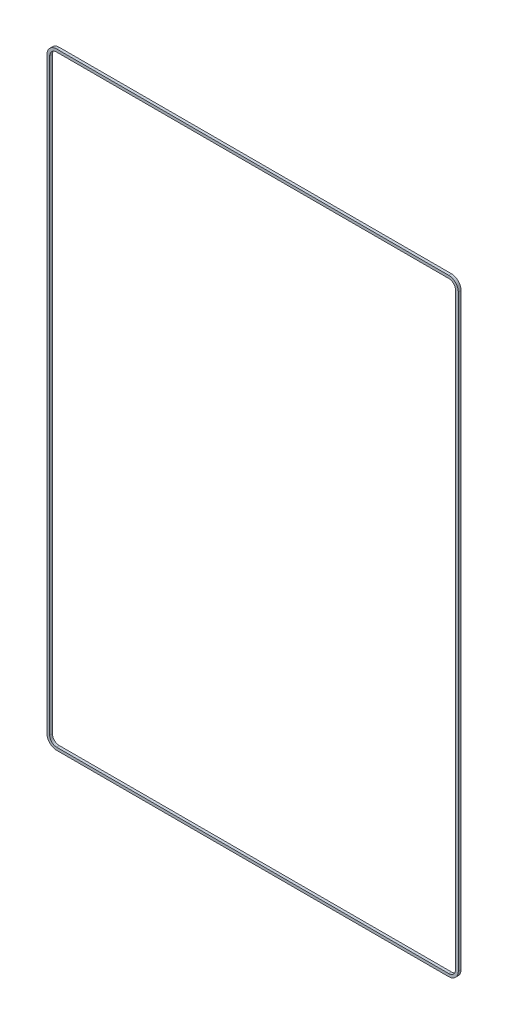
ISO-10303-21;
HEADER;
FILE_DESCRIPTION(('STEP AP214'),'2;1');
FILE_NAME('part.step','',(''),(''),'','','');
FILE_SCHEMA(('AUTOMOTIVE_DESIGN { 1 0 10303 214 1 1 1 1 }'));
ENDSEC;
DATA;
#1=APPLICATION_CONTEXT('core data for automotive mechanical design processes');
#2=APPLICATION_PROTOCOL_DEFINITION('international standard','automotive_design',2000,#1);
#3=PRODUCT_CONTEXT('',#1,'mechanical');
#4=PRODUCT('Part','Part','',(#3));
#5=PRODUCT_RELATED_PRODUCT_CATEGORY('part','',(#4));
#6=PRODUCT_DEFINITION_FORMATION('','',#4);
#7=PRODUCT_DEFINITION_CONTEXT('part definition',#1,'design');
#8=PRODUCT_DEFINITION('design','',#6,#7);
#9=PRODUCT_DEFINITION_SHAPE('','',#8);
#10=(LENGTH_UNIT() NAMED_UNIT(*) SI_UNIT(.MILLI.,.METRE.));
#11=(NAMED_UNIT(*) PLANE_ANGLE_UNIT() SI_UNIT($,.RADIAN.));
#12=(NAMED_UNIT(*) SI_UNIT($,.STERADIAN.) SOLID_ANGLE_UNIT());
#13=UNCERTAINTY_MEASURE_WITH_UNIT(LENGTH_MEASURE(1.E-05),#10,'distance_accuracy_value','');
#14=(GEOMETRIC_REPRESENTATION_CONTEXT(3) GLOBAL_UNCERTAINTY_ASSIGNED_CONTEXT((#13)) GLOBAL_UNIT_ASSIGNED_CONTEXT((#10,
#11,#12)) REPRESENTATION_CONTEXT('',''));
#15=CARTESIAN_POINT('',(0.,0.,0.));
#16=DIRECTION('',(0.,0.,1.));
#17=DIRECTION('',(1.,0.,0.));
#18=AXIS2_PLACEMENT_3D('',#15,#16,#17);
#19=CARTESIAN_POINT('',(0.,-0.127,1.778));
#20=DIRECTION('',(0.,1.,0.));
#21=DIRECTION('',(-1.,0.,0.));
#22=AXIS2_PLACEMENT_3D('',#19,#20,#21);
#23=PLANE('',#22);
#24=DIRECTION('',(1.,0.,0.));
#25=VECTOR('',#24,1.);
#26=CARTESIAN_POINT('',(0.,-0.127,0.));
#27=LINE('',#26,#25);
#28=CARTESIAN_POINT('',(4.31800000000003,-0.127,0.));
#29=VERTEX_POINT('',#28);
#30=CARTESIAN_POINT('',(258.318,-0.126999999999994,0.));
#31=VERTEX_POINT('',#30);
#32=EDGE_CURVE('E205',#29,#31,#27,.T.);
#33=ORIENTED_EDGE('',*,*,#32,.F.);
#34=DIRECTION('',(0.,0.,-1.));
#35=VECTOR('',#34,1.);
#36=CARTESIAN_POINT('',(4.31800000000003,-0.127,1.778));
#37=LINE('',#36,#35);
#38=CARTESIAN_POINT('',(4.31800000000003,-0.127,1.778));
#39=VERTEX_POINT('',#38);
#40=EDGE_CURVE('E11',#39,#29,#37,.T.);
#41=ORIENTED_EDGE('',*,*,#40,.F.);
#42=DIRECTION('',(1.,0.,0.));
#43=VECTOR('',#42,1.);
#44=CARTESIAN_POINT('',(0.,-0.127,1.778));
#45=LINE('',#44,#43);
#46=CARTESIAN_POINT('',(258.318,-0.126999999999994,1.778));
#47=VERTEX_POINT('',#46);
#48=EDGE_CURVE('E305',#39,#47,#45,.T.);
#49=ORIENTED_EDGE('',*,*,#48,.T.);
#50=DIRECTION('',(0.,0.,-1.));
#51=VECTOR('',#50,1.);
#52=CARTESIAN_POINT('',(258.318,-0.126999999999994,1.778));
#53=LINE('',#52,#51);
#54=EDGE_CURVE('E54',#47,#31,#53,.T.);
#55=ORIENTED_EDGE('',*,*,#54,.T.);
#56=EDGE_LOOP('',(#33,#41,#49,#55));
#57=FACE_BOUND('',#56,.T.);
#58=ADVANCED_FACE('F35',(#57),#23,.T.);
#59=CARTESIAN_POINT('',(4.318,4.318,1.778));
#60=DIRECTION('',(0.,0.,-1.));
#61=DIRECTION('',(-1.,0.,0.));
#62=AXIS2_PLACEMENT_3D('',#59,#60,#61);
#63=CYLINDRICAL_SURFACE('',#62,4.445);
#64=CARTESIAN_POINT('',(4.318,4.318,0.));
#65=DIRECTION('',(0.,0.,1.));
#66=DIRECTION('',(1.,0.,0.));
#67=AXIS2_PLACEMENT_3D('',#64,#65,#66);
#68=CIRCLE('',#67,4.445);
#69=CARTESIAN_POINT('',(-0.127,4.31800000000003,0.));
#70=VERTEX_POINT('',#69);
#71=EDGE_CURVE('E207',#29,#70,#68,.F.);
#72=ORIENTED_EDGE('',*,*,#71,.T.);
#73=DIRECTION('',(0.,0.,-1.));
#74=VECTOR('',#73,1.);
#75=CARTESIAN_POINT('',(-0.127,4.31800000000003,1.778));
#76=LINE('',#75,#74);
#77=CARTESIAN_POINT('',(-0.127,4.31800000000003,1.778));
#78=VERTEX_POINT('',#77);
#79=EDGE_CURVE('E45',#78,#70,#76,.T.);
#80=ORIENTED_EDGE('',*,*,#79,.F.);
#81=CARTESIAN_POINT('',(4.318,4.318,1.778));
#82=DIRECTION('',(0.,0.,1.));
#83=DIRECTION('',(1.,0.,0.));
#84=AXIS2_PLACEMENT_3D('',#81,#82,#83);
#85=CIRCLE('',#84,4.445);
#86=EDGE_CURVE('E307',#39,#78,#85,.F.);
#87=ORIENTED_EDGE('',*,*,#86,.F.);
#88=ORIENTED_EDGE('',*,*,#40,.T.);
#89=EDGE_LOOP('',(#72,#80,#87,#88));
#90=FACE_BOUND('',#89,.T.);
#91=ADVANCED_FACE('F333',(#90),#63,.F.);
#92=CARTESIAN_POINT('',(-0.127,0.,1.778));
#93=DIRECTION('',(-1.,0.,0.));
#94=DIRECTION('',(0.,0.,1.));
#95=AXIS2_PLACEMENT_3D('',#92,#93,#94);
#96=PLANE('',#95);
#97=DIRECTION('',(0.,1.,0.));
#98=VECTOR('',#97,1.);
#99=CARTESIAN_POINT('',(-0.127,0.,0.));
#100=LINE('',#99,#98);
#101=CARTESIAN_POINT('',(-0.127,385.318,0.));
#102=VERTEX_POINT('',#101);
#103=EDGE_CURVE('E210',#70,#102,#100,.T.);
#104=ORIENTED_EDGE('',*,*,#103,.T.);
#105=DIRECTION('',(0.,0.,-1.));
#106=VECTOR('',#105,1.);
#107=CARTESIAN_POINT('',(-0.127,385.318,1.778));
#108=LINE('',#107,#106);
#109=CARTESIAN_POINT('',(-0.127,385.318,1.778));
#110=VERTEX_POINT('',#109);
#111=EDGE_CURVE('E232',#110,#102,#108,.T.);
#112=ORIENTED_EDGE('',*,*,#111,.F.);
#113=DIRECTION('',(0.,1.,0.));
#114=VECTOR('',#113,1.);
#115=CARTESIAN_POINT('',(-0.127,0.,1.778));
#116=LINE('',#115,#114);
#117=EDGE_CURVE('E310',#78,#110,#116,.T.);
#118=ORIENTED_EDGE('',*,*,#117,.F.);
#119=ORIENTED_EDGE('',*,*,#79,.T.);
#120=EDGE_LOOP('',(#104,#112,#118,#119));
#121=FACE_BOUND('',#120,.T.);
#122=ADVANCED_FACE('F338',(#121),#96,.F.);
#123=CARTESIAN_POINT('',(4.318,385.318,1.778));
#124=DIRECTION('',(0.,0.,-1.));
#125=DIRECTION('',(-1.,0.,0.));
#126=AXIS2_PLACEMENT_3D('',#123,#124,#125);
#127=CYLINDRICAL_SURFACE('',#126,4.44499999999999);
#128=CARTESIAN_POINT('',(4.318,385.318,0.));
#129=DIRECTION('',(0.,0.,1.));
#130=DIRECTION('',(1.,0.,0.));
#131=AXIS2_PLACEMENT_3D('',#128,#129,#130);
#132=CIRCLE('',#131,4.44499999999999);
#133=CARTESIAN_POINT('',(4.318,389.763,0.));
#134=VERTEX_POINT('',#133);
#135=EDGE_CURVE('E213',#102,#134,#132,.F.);
#136=ORIENTED_EDGE('',*,*,#135,.T.);
#137=DIRECTION('',(0.,0.,-1.));
#138=VECTOR('',#137,1.);
#139=CARTESIAN_POINT('',(4.318,389.763,1.778));
#140=LINE('',#139,#138);
#141=CARTESIAN_POINT('',(4.318,389.763,1.778));
#142=VERTEX_POINT('',#141);
#143=EDGE_CURVE('E229',#142,#134,#140,.T.);
#144=ORIENTED_EDGE('',*,*,#143,.F.);
#145=CARTESIAN_POINT('',(4.318,385.318,1.778));
#146=DIRECTION('',(0.,0.,1.));
#147=DIRECTION('',(1.,0.,0.));
#148=AXIS2_PLACEMENT_3D('',#145,#146,#147);
#149=CIRCLE('',#148,4.44499999999999);
#150=EDGE_CURVE('E313',#110,#142,#149,.F.);
#151=ORIENTED_EDGE('',*,*,#150,.F.);
#152=ORIENTED_EDGE('',*,*,#111,.T.);
#153=EDGE_LOOP('',(#136,#144,#151,#152));
#154=FACE_BOUND('',#153,.T.);
#155=ADVANCED_FACE('F317',(#154),#127,.F.);
#156=CARTESIAN_POINT('',(0.,389.763,1.778));
#157=DIRECTION('',(0.,1.,0.));
#158=DIRECTION('',(0.,0.,1.));
#159=AXIS2_PLACEMENT_3D('',#156,#157,#158);
#160=PLANE('',#159);
#161=DIRECTION('',(1.,0.,0.));
#162=VECTOR('',#161,1.);
#163=CARTESIAN_POINT('',(0.,389.763,0.));
#164=LINE('',#163,#162);
#165=CARTESIAN_POINT('',(258.318,389.763,0.));
#166=VERTEX_POINT('',#165);
#167=EDGE_CURVE('E216',#134,#166,#164,.T.);
#168=ORIENTED_EDGE('',*,*,#167,.T.);
#169=DIRECTION('',(0.,0.,-1.));
#170=VECTOR('',#169,1.);
#171=CARTESIAN_POINT('',(258.318,389.763,1.778));
#172=LINE('',#171,#170);
#173=CARTESIAN_POINT('',(258.318,389.763,1.778));
#174=VERTEX_POINT('',#173);
#175=EDGE_CURVE('E174',#174,#166,#172,.T.);
#176=ORIENTED_EDGE('',*,*,#175,.F.);
#177=DIRECTION('',(1.,0.,0.));
#178=VECTOR('',#177,1.);
#179=CARTESIAN_POINT('',(0.,389.763,1.778));
#180=LINE('',#179,#178);
#181=EDGE_CURVE('E163',#142,#174,#180,.T.);
#182=ORIENTED_EDGE('',*,*,#181,.F.);
#183=ORIENTED_EDGE('',*,*,#143,.T.);
#184=EDGE_LOOP('',(#168,#176,#182,#183));
#185=FACE_BOUND('',#184,.T.);
#186=ADVANCED_FACE('F319',(#185),#160,.F.);
#187=CARTESIAN_POINT('',(258.318,385.318,1.778));
#188=DIRECTION('',(0.,0.,-1.));
#189=DIRECTION('',(-1.,0.,0.));
#190=AXIS2_PLACEMENT_3D('',#187,#188,#189);
#191=CYLINDRICAL_SURFACE('',#190,4.44499999999998);
#192=CARTESIAN_POINT('',(258.318,385.318,0.));
#193=DIRECTION('',(0.,0.,1.));
#194=DIRECTION('',(1.,0.,0.));
#195=AXIS2_PLACEMENT_3D('',#192,#193,#194);
#196=CIRCLE('',#195,4.44499999999998);
#197=CARTESIAN_POINT('',(262.763,385.318,0.));
#198=VERTEX_POINT('',#197);
#199=EDGE_CURVE('E171',#166,#198,#196,.F.);
#200=ORIENTED_EDGE('',*,*,#199,.T.);
#201=DIRECTION('',(0.,0.,-1.));
#202=VECTOR('',#201,1.);
#203=CARTESIAN_POINT('',(262.763,385.318,1.778));
#204=LINE('',#203,#202);
#205=CARTESIAN_POINT('',(262.763,385.318,1.778));
#206=VERTEX_POINT('',#205);
#207=EDGE_CURVE('E169',#206,#198,#204,.T.);
#208=ORIENTED_EDGE('',*,*,#207,.F.);
#209=CARTESIAN_POINT('',(258.318,385.318,1.778));
#210=DIRECTION('',(0.,0.,1.));
#211=DIRECTION('',(1.,0.,0.));
#212=AXIS2_PLACEMENT_3D('',#209,#210,#211);
#213=CIRCLE('',#212,4.44499999999998);
#214=EDGE_CURVE('E155',#174,#206,#213,.F.);
#215=ORIENTED_EDGE('',*,*,#214,.F.);
#216=ORIENTED_EDGE('',*,*,#175,.T.);
#217=EDGE_LOOP('',(#200,#208,#215,#216));
#218=FACE_BOUND('',#217,.T.);
#219=ADVANCED_FACE('F170',(#218),#191,.F.);
#220=CARTESIAN_POINT('',(262.763,0.,1.778));
#221=DIRECTION('',(-1.,0.,0.));
#222=DIRECTION('',(0.,-1.,0.));
#223=AXIS2_PLACEMENT_3D('',#220,#221,#222);
#224=PLANE('',#223);
#225=DIRECTION('',(0.,1.,0.));
#226=VECTOR('',#225,1.);
#227=CARTESIAN_POINT('',(262.763,0.,0.));
#228=LINE('',#227,#226);
#229=CARTESIAN_POINT('',(262.763,4.31800000000003,0.));
#230=VERTEX_POINT('',#229);
#231=EDGE_CURVE('E220',#230,#198,#228,.T.);
#232=ORIENTED_EDGE('',*,*,#231,.F.);
#233=DIRECTION('',(0.,0.,-1.));
#234=VECTOR('',#233,1.);
#235=CARTESIAN_POINT('',(262.763,4.31800000000003,1.778));
#236=LINE('',#235,#234);
#237=CARTESIAN_POINT('',(262.763,4.31800000000003,1.778));
#238=VERTEX_POINT('',#237);
#239=EDGE_CURVE('E103',#238,#230,#236,.T.);
#240=ORIENTED_EDGE('',*,*,#239,.F.);
#241=DIRECTION('',(0.,1.,0.));
#242=VECTOR('',#241,1.);
#243=CARTESIAN_POINT('',(262.763,0.,1.778));
#244=LINE('',#243,#242);
#245=EDGE_CURVE('E161',#238,#206,#244,.T.);
#246=ORIENTED_EDGE('',*,*,#245,.T.);
#247=ORIENTED_EDGE('',*,*,#207,.T.);
#248=EDGE_LOOP('',(#232,#240,#246,#247));
#249=FACE_BOUND('',#248,.T.);
#250=ADVANCED_FACE('F176',(#249),#224,.T.);
#251=CARTESIAN_POINT('',(4.318,4.318,1.778));
#252=DIRECTION('',(0.,0.,-1.));
#253=DIRECTION('',(-1.,0.,0.));
#254=AXIS2_PLACEMENT_3D('',#251,#252,#253);
#255=CYLINDRICAL_SURFACE('',#254,6.223);
#256=CARTESIAN_POINT('',(4.318,4.318,0.));
#257=DIRECTION('',(0.,0.,1.));
#258=DIRECTION('',(1.,0.,0.));
#259=AXIS2_PLACEMENT_3D('',#256,#257,#258);
#260=CIRCLE('',#259,6.223);
#261=CARTESIAN_POINT('',(4.31800000000003,-1.905,0.));
#262=VERTEX_POINT('',#261);
#263=CARTESIAN_POINT('',(-1.905,4.31800000000003,0.));
#264=VERTEX_POINT('',#263);
#265=EDGE_CURVE('E183',#262,#264,#260,.F.);
#266=ORIENTED_EDGE('',*,*,#265,.F.);
#267=DIRECTION('',(0.,0.,-1.));
#268=VECTOR('',#267,1.);
#269=CARTESIAN_POINT('',(4.31800000000003,-1.905,1.778));
#270=LINE('',#269,#268);
#271=CARTESIAN_POINT('',(4.31800000000003,-1.905,1.778));
#272=VERTEX_POINT('',#271);
#273=EDGE_CURVE('E39',#272,#262,#270,.T.);
#274=ORIENTED_EDGE('',*,*,#273,.F.);
#275=CARTESIAN_POINT('',(4.318,4.318,1.778));
#276=DIRECTION('',(0.,0.,1.));
#277=DIRECTION('',(1.,0.,0.));
#278=AXIS2_PLACEMENT_3D('',#275,#276,#277);
#279=CIRCLE('',#278,6.223);
#280=CARTESIAN_POINT('',(-1.905,4.31800000000003,1.778));
#281=VERTEX_POINT('',#280);
#282=EDGE_CURVE('E225',#272,#281,#279,.F.);
#283=ORIENTED_EDGE('',*,*,#282,.T.);
#284=DIRECTION('',(0.,0.,-1.));
#285=VECTOR('',#284,1.);
#286=CARTESIAN_POINT('',(-1.905,4.31800000000003,1.778));
#287=LINE('',#286,#285);
#288=EDGE_CURVE('E179',#281,#264,#287,.T.);
#289=ORIENTED_EDGE('',*,*,#288,.T.);
#290=EDGE_LOOP('',(#266,#274,#283,#289));
#291=FACE_BOUND('',#290,.T.);
#292=ADVANCED_FACE('F37',(#291),#255,.T.);
#293=CARTESIAN_POINT('',(0.,-1.905,1.778));
#294=DIRECTION('',(0.,1.,0.));
#295=DIRECTION('',(-1.,0.,0.));
#296=AXIS2_PLACEMENT_3D('',#293,#294,#295);
#297=PLANE('',#296);
#298=DIRECTION('',(1.,0.,0.));
#299=VECTOR('',#298,1.);
#300=CARTESIAN_POINT('',(0.,-1.905,0.));
#301=LINE('',#300,#299);
#302=CARTESIAN_POINT('',(258.318,-1.905,0.));
#303=VERTEX_POINT('',#302);
#304=EDGE_CURVE('E186',#262,#303,#301,.T.);
#305=ORIENTED_EDGE('',*,*,#304,.T.);
#306=DIRECTION('',(0.,0.,-1.));
#307=VECTOR('',#306,1.);
#308=CARTESIAN_POINT('',(258.318,-1.905,1.778));
#309=LINE('',#308,#307);
#310=CARTESIAN_POINT('',(258.318,-1.905,1.778));
#311=VERTEX_POINT('',#310);
#312=EDGE_CURVE('E248',#311,#303,#309,.T.);
#313=ORIENTED_EDGE('',*,*,#312,.F.);
#314=DIRECTION('',(1.,0.,0.));
#315=VECTOR('',#314,1.);
#316=CARTESIAN_POINT('',(0.,-1.905,1.778));
#317=LINE('',#316,#315);
#318=EDGE_CURVE('E257',#272,#311,#317,.T.);
#319=ORIENTED_EDGE('',*,*,#318,.F.);
#320=ORIENTED_EDGE('',*,*,#273,.T.);
#321=EDGE_LOOP('',(#305,#313,#319,#320));
#322=FACE_BOUND('',#321,.T.);
#323=ADVANCED_FACE('F256',(#322),#297,.F.);
#324=CARTESIAN_POINT('',(258.318,4.318,1.778));
#325=DIRECTION('',(0.,0.,-1.));
#326=DIRECTION('',(-1.,0.,0.));
#327=AXIS2_PLACEMENT_3D('',#324,#325,#326);
#328=CYLINDRICAL_SURFACE('',#327,6.22299999999999);
#329=CARTESIAN_POINT('',(258.318,4.318,0.));
#330=DIRECTION('',(0.,0.,1.));
#331=DIRECTION('',(1.,0.,0.));
#332=AXIS2_PLACEMENT_3D('',#329,#330,#331);
#333=CIRCLE('',#332,6.22299999999999);
#334=CARTESIAN_POINT('',(264.541,4.318,0.));
#335=VERTEX_POINT('',#334);
#336=EDGE_CURVE('E188',#303,#335,#333,.T.);
#337=ORIENTED_EDGE('',*,*,#336,.T.);
#338=DIRECTION('',(0.,0.,-1.));
#339=VECTOR('',#338,1.);
#340=CARTESIAN_POINT('',(264.541,4.318,1.778));
#341=LINE('',#340,#339);
#342=CARTESIAN_POINT('',(264.541,4.318,1.778));
#343=VERTEX_POINT('',#342);
#344=EDGE_CURVE('E246',#343,#335,#341,.T.);
#345=ORIENTED_EDGE('',*,*,#344,.F.);
#346=CARTESIAN_POINT('',(258.318,4.318,1.778));
#347=DIRECTION('',(0.,0.,1.));
#348=DIRECTION('',(1.,0.,0.));
#349=AXIS2_PLACEMENT_3D('',#346,#347,#348);
#350=CIRCLE('',#349,6.22299999999999);
#351=EDGE_CURVE('E293',#311,#343,#350,.T.);
#352=ORIENTED_EDGE('',*,*,#351,.F.);
#353=ORIENTED_EDGE('',*,*,#312,.T.);
#354=EDGE_LOOP('',(#337,#345,#352,#353));
#355=FACE_BOUND('',#354,.T.);
#356=ADVANCED_FACE('F292',(#355),#328,.T.);
#357=CARTESIAN_POINT('',(264.541,0.,1.778));
#358=DIRECTION('',(-1.,0.,0.));
#359=DIRECTION('',(0.,-1.,0.));
#360=AXIS2_PLACEMENT_3D('',#357,#358,#359);
#361=PLANE('',#360);
#362=DIRECTION('',(0.,1.,0.));
#363=VECTOR('',#362,1.);
#364=CARTESIAN_POINT('',(264.541,0.,0.));
#365=LINE('',#364,#363);
#366=CARTESIAN_POINT('',(264.541,385.318,0.));
#367=VERTEX_POINT('',#366);
#368=EDGE_CURVE('E190',#335,#367,#365,.T.);
#369=ORIENTED_EDGE('',*,*,#368,.T.);
#370=DIRECTION('',(0.,0.,-1.));
#371=VECTOR('',#370,1.);
#372=CARTESIAN_POINT('',(264.541,385.318,1.778));
#373=LINE('',#372,#371);
#374=CARTESIAN_POINT('',(264.541,385.318,1.778));
#375=VERTEX_POINT('',#374);
#376=EDGE_CURVE('E244',#375,#367,#373,.T.);
#377=ORIENTED_EDGE('',*,*,#376,.F.);
#378=DIRECTION('',(0.,1.,0.));
#379=VECTOR('',#378,1.);
#380=CARTESIAN_POINT('',(264.541,0.,1.778));
#381=LINE('',#380,#379);
#382=EDGE_CURVE('E291',#343,#375,#381,.T.);
#383=ORIENTED_EDGE('',*,*,#382,.F.);
#384=ORIENTED_EDGE('',*,*,#344,.T.);
#385=EDGE_LOOP('',(#369,#377,#383,#384));
#386=FACE_BOUND('',#385,.T.);
#387=ADVANCED_FACE('F288',(#386),#361,.F.);
#388=CARTESIAN_POINT('',(258.318,385.318,1.778));
#389=DIRECTION('',(0.,0.,-1.));
#390=DIRECTION('',(-1.,0.,0.));
#391=AXIS2_PLACEMENT_3D('',#388,#389,#390);
#392=CYLINDRICAL_SURFACE('',#391,6.22299999999998);
#393=CARTESIAN_POINT('',(258.318,385.318,0.));
#394=DIRECTION('',(0.,0.,1.));
#395=DIRECTION('',(1.,0.,0.));
#396=AXIS2_PLACEMENT_3D('',#393,#394,#395);
#397=CIRCLE('',#396,6.22299999999998);
#398=CARTESIAN_POINT('',(258.318,391.541,0.));
#399=VERTEX_POINT('',#398);
#400=EDGE_CURVE('E193',#399,#367,#397,.F.);
#401=ORIENTED_EDGE('',*,*,#400,.F.);
#402=DIRECTION('',(0.,0.,-1.));
#403=VECTOR('',#402,1.);
#404=CARTESIAN_POINT('',(258.318,391.541,1.778));
#405=LINE('',#404,#403);
#406=CARTESIAN_POINT('',(258.318,391.541,1.778));
#407=VERTEX_POINT('',#406);
#408=EDGE_CURVE('E242',#407,#399,#405,.T.);
#409=ORIENTED_EDGE('',*,*,#408,.F.);
#410=CARTESIAN_POINT('',(258.318,385.318,1.778));
#411=DIRECTION('',(0.,0.,1.));
#412=DIRECTION('',(1.,0.,0.));
#413=AXIS2_PLACEMENT_3D('',#410,#411,#412);
#414=CIRCLE('',#413,6.22299999999998);
#415=EDGE_CURVE('E296',#407,#375,#414,.F.);
#416=ORIENTED_EDGE('',*,*,#415,.T.);
#417=ORIENTED_EDGE('',*,*,#376,.T.);
#418=EDGE_LOOP('',(#401,#409,#416,#417));
#419=FACE_BOUND('',#418,.T.);
#420=ADVANCED_FACE('F285',(#419),#392,.T.);
#421=CARTESIAN_POINT('',(0.,391.541,1.778));
#422=DIRECTION('',(0.,1.,0.));
#423=DIRECTION('',(0.,0.,1.));
#424=AXIS2_PLACEMENT_3D('',#421,#422,#423);
#425=PLANE('',#424);
#426=DIRECTION('',(1.,0.,0.));
#427=VECTOR('',#426,1.);
#428=CARTESIAN_POINT('',(0.,391.541,0.));
#429=LINE('',#428,#427);
#430=CARTESIAN_POINT('',(4.318,391.541,0.));
#431=VERTEX_POINT('',#430);
#432=EDGE_CURVE('E196',#431,#399,#429,.T.);
#433=ORIENTED_EDGE('',*,*,#432,.F.);
#434=DIRECTION('',(0.,0.,-1.));
#435=VECTOR('',#434,1.);
#436=CARTESIAN_POINT('',(4.318,391.541,1.778));
#437=LINE('',#436,#435);
#438=CARTESIAN_POINT('',(4.318,391.541,1.778));
#439=VERTEX_POINT('',#438);
#440=EDGE_CURVE('E240',#439,#431,#437,.T.);
#441=ORIENTED_EDGE('',*,*,#440,.F.);
#442=DIRECTION('',(1.,0.,0.));
#443=VECTOR('',#442,1.);
#444=CARTESIAN_POINT('',(0.,391.541,1.778));
#445=LINE('',#444,#443);
#446=EDGE_CURVE('E281',#439,#407,#445,.T.);
#447=ORIENTED_EDGE('',*,*,#446,.T.);
#448=ORIENTED_EDGE('',*,*,#408,.T.);
#449=EDGE_LOOP('',(#433,#441,#447,#448));
#450=FACE_BOUND('',#449,.T.);
#451=ADVANCED_FACE('F279',(#450),#425,.T.);
#452=CARTESIAN_POINT('',(4.318,385.318,1.778));
#453=DIRECTION('',(0.,0.,-1.));
#454=DIRECTION('',(-1.,0.,0.));
#455=AXIS2_PLACEMENT_3D('',#452,#453,#454);
#456=CYLINDRICAL_SURFACE('',#455,6.22299999999999);
#457=CARTESIAN_POINT('',(4.318,385.318,0.));
#458=DIRECTION('',(0.,0.,1.));
#459=DIRECTION('',(1.,0.,0.));
#460=AXIS2_PLACEMENT_3D('',#457,#458,#459);
#461=CIRCLE('',#460,6.22299999999999);
#462=CARTESIAN_POINT('',(-1.905,385.318,0.));
#463=VERTEX_POINT('',#462);
#464=EDGE_CURVE('E199',#463,#431,#461,.F.);
#465=ORIENTED_EDGE('',*,*,#464,.F.);
#466=DIRECTION('',(0.,0.,-1.));
#467=VECTOR('',#466,1.);
#468=CARTESIAN_POINT('',(-1.905,385.318,1.778));
#469=LINE('',#468,#467);
#470=CARTESIAN_POINT('',(-1.905,385.318,1.778));
#471=VERTEX_POINT('',#470);
#472=EDGE_CURVE('E238',#471,#463,#469,.T.);
#473=ORIENTED_EDGE('',*,*,#472,.F.);
#474=CARTESIAN_POINT('',(4.318,385.318,1.778));
#475=DIRECTION('',(0.,0.,1.));
#476=DIRECTION('',(1.,0.,0.));
#477=AXIS2_PLACEMENT_3D('',#474,#475,#476);
#478=CIRCLE('',#477,6.22299999999999);
#479=EDGE_CURVE('E275',#471,#439,#478,.F.);
#480=ORIENTED_EDGE('',*,*,#479,.T.);
#481=ORIENTED_EDGE('',*,*,#440,.T.);
#482=EDGE_LOOP('',(#465,#473,#480,#481));
#483=FACE_BOUND('',#482,.T.);
#484=ADVANCED_FACE('F272',(#483),#456,.T.);
#485=CARTESIAN_POINT('',(-1.905,0.,1.778));
#486=DIRECTION('',(-1.,0.,0.));
#487=DIRECTION('',(0.,0.,1.));
#488=AXIS2_PLACEMENT_3D('',#485,#486,#487);
#489=PLANE('',#488);
#490=DIRECTION('',(0.,1.,0.));
#491=VECTOR('',#490,1.);
#492=CARTESIAN_POINT('',(-1.905,0.,0.));
#493=LINE('',#492,#491);
#494=EDGE_CURVE('E202',#264,#463,#493,.T.);
#495=ORIENTED_EDGE('',*,*,#494,.F.);
#496=ORIENTED_EDGE('',*,*,#288,.F.);
#497=DIRECTION('',(0.,1.,0.));
#498=VECTOR('',#497,1.);
#499=CARTESIAN_POINT('',(-1.905,0.,1.778));
#500=LINE('',#499,#498);
#501=EDGE_CURVE('E268',#281,#471,#500,.T.);
#502=ORIENTED_EDGE('',*,*,#501,.T.);
#503=ORIENTED_EDGE('',*,*,#472,.T.);
#504=EDGE_LOOP('',(#495,#496,#502,#503));
#505=FACE_BOUND('',#504,.T.);
#506=ADVANCED_FACE('F267',(#505),#489,.T.);
#507=CARTESIAN_POINT('',(258.318,4.318,1.778));
#508=DIRECTION('',(0.,0.,-1.));
#509=DIRECTION('',(-1.,0.,0.));
#510=AXIS2_PLACEMENT_3D('',#507,#508,#509);
#511=CYLINDRICAL_SURFACE('',#510,4.44499999999999);
#512=CARTESIAN_POINT('',(258.318,4.318,0.));
#513=DIRECTION('',(0.,0.,1.));
#514=DIRECTION('',(1.,0.,0.));
#515=AXIS2_PLACEMENT_3D('',#512,#513,#514);
#516=CIRCLE('',#515,4.44499999999999);
#517=EDGE_CURVE('E222',#31,#230,#516,.T.);
#518=ORIENTED_EDGE('',*,*,#517,.F.);
#519=ORIENTED_EDGE('',*,*,#54,.F.);
#520=CARTESIAN_POINT('',(258.318,4.318,1.778));
#521=DIRECTION('',(0.,0.,1.));
#522=DIRECTION('',(1.,0.,0.));
#523=AXIS2_PLACEMENT_3D('',#520,#521,#522);
#524=CIRCLE('',#523,4.44499999999999);
#525=EDGE_CURVE('E177',#47,#238,#524,.T.);
#526=ORIENTED_EDGE('',*,*,#525,.T.);
#527=ORIENTED_EDGE('',*,*,#239,.T.);
#528=EDGE_LOOP('',(#518,#519,#526,#527));
#529=FACE_BOUND('',#528,.T.);
#530=ADVANCED_FACE('F321',(#529),#511,.F.);
#531=CARTESIAN_POINT('',(0.,0.,1.778));
#532=DIRECTION('',(0.,0.,1.));
#533=DIRECTION('',(1.,0.,0.));
#534=AXIS2_PLACEMENT_3D('',#531,#532,#533);
#535=PLANE('',#534);
#536=ORIENTED_EDGE('',*,*,#282,.F.);
#537=ORIENTED_EDGE('',*,*,#318,.T.);
#538=ORIENTED_EDGE('',*,*,#351,.T.);
#539=ORIENTED_EDGE('',*,*,#382,.T.);
#540=ORIENTED_EDGE('',*,*,#415,.F.);
#541=ORIENTED_EDGE('',*,*,#446,.F.);
#542=ORIENTED_EDGE('',*,*,#479,.F.);
#543=ORIENTED_EDGE('',*,*,#501,.F.);
#544=EDGE_LOOP('',(#536,#537,#538,#539,#540,#541,#542,#543));
#545=FACE_BOUND('',#544,.T.);
#546=ORIENTED_EDGE('',*,*,#48,.F.);
#547=ORIENTED_EDGE('',*,*,#86,.T.);
#548=ORIENTED_EDGE('',*,*,#117,.T.);
#549=ORIENTED_EDGE('',*,*,#150,.T.);
#550=ORIENTED_EDGE('',*,*,#181,.T.);
#551=ORIENTED_EDGE('',*,*,#214,.T.);
#552=ORIENTED_EDGE('',*,*,#245,.F.);
#553=ORIENTED_EDGE('',*,*,#525,.F.);
#554=EDGE_LOOP('',(#546,#547,#548,#549,#550,#551,#552,#553));
#555=FACE_BOUND('',#554,.T.);
#556=ADVANCED_FACE('F158',(#545,#555),#535,.T.);
#557=CARTESIAN_POINT('',(0.,0.,0.));
#558=DIRECTION('',(0.,0.,1.));
#559=DIRECTION('',(1.,0.,0.));
#560=AXIS2_PLACEMENT_3D('',#557,#558,#559);
#561=PLANE('',#560);
#562=ORIENTED_EDGE('',*,*,#265,.T.);
#563=ORIENTED_EDGE('',*,*,#494,.T.);
#564=ORIENTED_EDGE('',*,*,#464,.T.);
#565=ORIENTED_EDGE('',*,*,#432,.T.);
#566=ORIENTED_EDGE('',*,*,#400,.T.);
#567=ORIENTED_EDGE('',*,*,#368,.F.);
#568=ORIENTED_EDGE('',*,*,#336,.F.);
#569=ORIENTED_EDGE('',*,*,#304,.F.);
#570=EDGE_LOOP('',(#562,#563,#564,#565,#566,#567,#568,#569));
#571=FACE_BOUND('',#570,.T.);
#572=ORIENTED_EDGE('',*,*,#32,.T.);
#573=ORIENTED_EDGE('',*,*,#517,.T.);
#574=ORIENTED_EDGE('',*,*,#231,.T.);
#575=ORIENTED_EDGE('',*,*,#199,.F.);
#576=ORIENTED_EDGE('',*,*,#167,.F.);
#577=ORIENTED_EDGE('',*,*,#135,.F.);
#578=ORIENTED_EDGE('',*,*,#103,.F.);
#579=ORIENTED_EDGE('',*,*,#71,.F.);
#580=EDGE_LOOP('',(#572,#573,#574,#575,#576,#577,#578,#579));
#581=FACE_BOUND('',#580,.T.);
#582=ADVANCED_FACE('F260',(#571,#581),#561,.F.);
#583=CLOSED_SHELL('',(#58,#91,#122,#155,#186,#219,#250,#292,#323,#356,#387,#420,#451,#484,#506,
#530,#556,#582));
#584=MANIFOLD_SOLID_BREP('B2',#583);
#585=ADVANCED_BREP_SHAPE_REPRESENTATION('',(#18,#584),#14);
#586=SHAPE_DEFINITION_REPRESENTATION(#9,#585);
ENDSEC;
END-ISO-10303-21;
